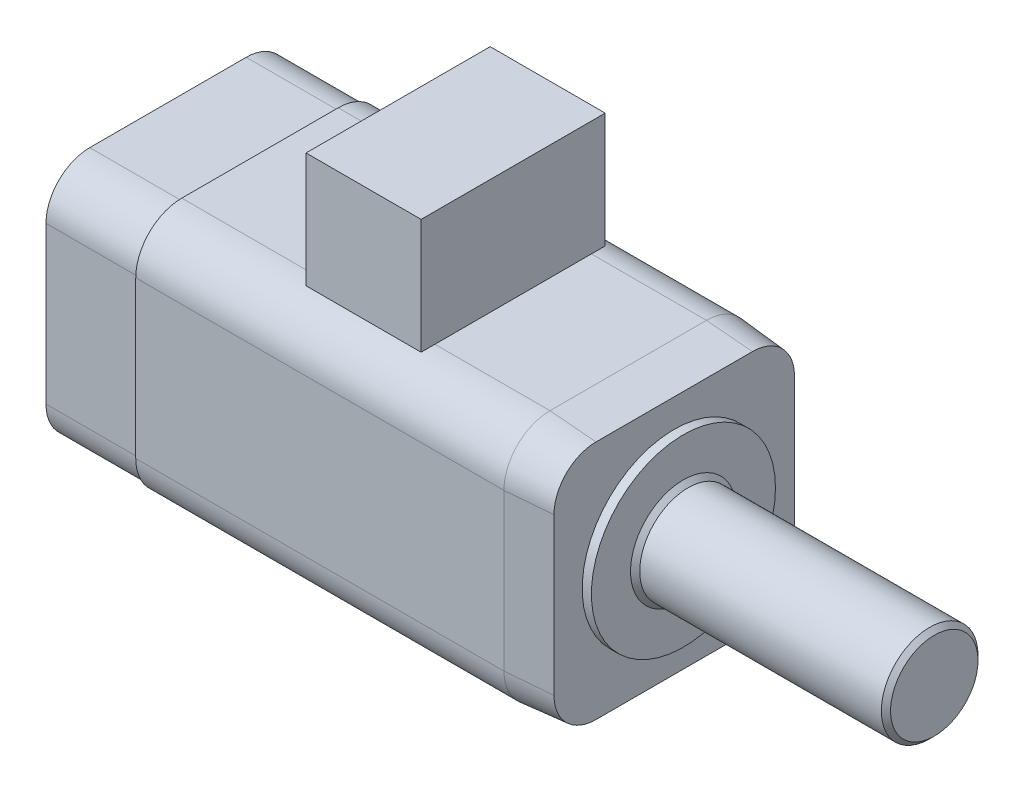
ISO-10303-21;
HEADER;
FILE_DESCRIPTION(('STEP AP214'),'2;1');
FILE_NAME('part.step','',(''),(''),'','','');
FILE_SCHEMA(('AUTOMOTIVE_DESIGN { 1 0 10303 214 1 1 1 1 }'));
ENDSEC;
DATA;
#1=APPLICATION_CONTEXT('core data for automotive mechanical design processes');
#2=APPLICATION_PROTOCOL_DEFINITION('international standard','automotive_design',2000,#1);
#3=PRODUCT_CONTEXT('',#1,'mechanical');
#4=PRODUCT('Part','Part','',(#3));
#5=PRODUCT_RELATED_PRODUCT_CATEGORY('part','',(#4));
#6=PRODUCT_DEFINITION_FORMATION('','',#4);
#7=PRODUCT_DEFINITION_CONTEXT('part definition',#1,'design');
#8=PRODUCT_DEFINITION('design','',#6,#7);
#9=PRODUCT_DEFINITION_SHAPE('','',#8);
#10=(LENGTH_UNIT() NAMED_UNIT(*) SI_UNIT(.MILLI.,.METRE.));
#11=(NAMED_UNIT(*) PLANE_ANGLE_UNIT() SI_UNIT($,.RADIAN.));
#12=(NAMED_UNIT(*) SI_UNIT($,.STERADIAN.) SOLID_ANGLE_UNIT());
#13=UNCERTAINTY_MEASURE_WITH_UNIT(LENGTH_MEASURE(1.E-05),#10,'distance_accuracy_value','');
#14=(GEOMETRIC_REPRESENTATION_CONTEXT(3) GLOBAL_UNCERTAINTY_ASSIGNED_CONTEXT((#13)) GLOBAL_UNIT_ASSIGNED_CONTEXT((#10,
#11,#12)) REPRESENTATION_CONTEXT('',''));
#15=CARTESIAN_POINT('',(0.,0.,0.));
#16=DIRECTION('',(0.,0.,1.));
#17=DIRECTION('',(1.,0.,0.));
#18=AXIS2_PLACEMENT_3D('',#15,#16,#17);
#19=CARTESIAN_POINT('',(-160.,34.0000000000001,-34.0000000000001));
#20=DIRECTION('',(-1.,0.,0.));
#21=DIRECTION('',(0.,0.,1.));
#22=AXIS2_PLACEMENT_3D('',#19,#20,#21);
#23=PLANE('',#22);
#24=CARTESIAN_POINT('',(-160.,34.0000000000001,-34.0000000000001));
#25=DIRECTION('',(-1.,0.,0.));
#26=DIRECTION('',(0.,0.,1.));
#27=AXIS2_PLACEMENT_3D('',#24,#25,#26);
#28=CIRCLE('',#27,20.);
#29=CARTESIAN_POINT('',(-160.,54.0000000000001,-34.0000000000001));
#30=VERTEX_POINT('',#29);
#31=CARTESIAN_POINT('',(-160.,34.0000000000001,-54.0000000000001));
#32=VERTEX_POINT('',#31);
#33=EDGE_CURVE('E269',#30,#32,#28,.T.);
#34=ORIENTED_EDGE('',*,*,#33,.T.);
#35=DIRECTION('',(0.,-1.,0.));
#36=VECTOR('',#35,1.);
#37=CARTESIAN_POINT('',(-160.,34.0000000000001,-54.0000000000001));
#38=LINE('',#37,#36);
#39=CARTESIAN_POINT('',(-160.,-34.0000000000001,-54.0000000000001));
#40=VERTEX_POINT('',#39);
#41=EDGE_CURVE('E272',#32,#40,#38,.T.);
#42=ORIENTED_EDGE('',*,*,#41,.T.);
#43=CARTESIAN_POINT('',(-160.,-34.0000000000001,-34.0000000000001));
#44=DIRECTION('',(-1.,0.,0.));
#45=DIRECTION('',(0.,0.,1.));
#46=AXIS2_PLACEMENT_3D('',#43,#44,#45);
#47=CIRCLE('',#46,19.9999999999999);
#48=CARTESIAN_POINT('',(-160.,-54.0000000000001,-34.0000000000002));
#49=VERTEX_POINT('',#48);
#50=EDGE_CURVE('E274',#40,#49,#47,.T.);
#51=ORIENTED_EDGE('',*,*,#50,.T.);
#52=DIRECTION('',(0.,0.,1.));
#53=VECTOR('',#52,1.);
#54=CARTESIAN_POINT('',(-160.,-54.0000000000001,-34.0000000000002));
#55=LINE('',#54,#53);
#56=CARTESIAN_POINT('',(-160.,-54.0000000000001,34.0000000000001));
#57=VERTEX_POINT('',#56);
#58=EDGE_CURVE('E276',#49,#57,#55,.T.);
#59=ORIENTED_EDGE('',*,*,#58,.T.);
#60=CARTESIAN_POINT('',(-160.,-34.0000000000001,34.0000000000001));
#61=DIRECTION('',(-1.,0.,0.));
#62=DIRECTION('',(0.,0.,1.));
#63=AXIS2_PLACEMENT_3D('',#60,#61,#62);
#64=CIRCLE('',#63,20.);
#65=CARTESIAN_POINT('',(-160.,-34.0000000000001,54.0000000000001));
#66=VERTEX_POINT('',#65);
#67=EDGE_CURVE('E278',#57,#66,#64,.T.);
#68=ORIENTED_EDGE('',*,*,#67,.T.);
#69=DIRECTION('',(0.,1.,0.));
#70=VECTOR('',#69,1.);
#71=CARTESIAN_POINT('',(-160.,-34.0000000000001,54.0000000000001));
#72=LINE('',#71,#70);
#73=CARTESIAN_POINT('',(-160.,34.0000000000001,54.));
#74=VERTEX_POINT('',#73);
#75=EDGE_CURVE('E280',#66,#74,#72,.T.);
#76=ORIENTED_EDGE('',*,*,#75,.T.);
#77=CARTESIAN_POINT('',(-160.,34.0000000000001,34.0000000000001));
#78=DIRECTION('',(-1.,0.,0.));
#79=DIRECTION('',(0.,0.,1.));
#80=AXIS2_PLACEMENT_3D('',#77,#78,#79);
#81=CIRCLE('',#80,20.);
#82=CARTESIAN_POINT('',(-160.,54.0000000000001,34.0000000000001));
#83=VERTEX_POINT('',#82);
#84=EDGE_CURVE('E282',#74,#83,#81,.T.);
#85=ORIENTED_EDGE('',*,*,#84,.T.);
#86=DIRECTION('',(0.,0.,-1.));
#87=VECTOR('',#86,1.);
#88=CARTESIAN_POINT('',(-160.,54.0000000000001,34.0000000000001));
#89=LINE('',#88,#87);
#90=EDGE_CURVE('E284',#83,#30,#89,.T.);
#91=ORIENTED_EDGE('',*,*,#90,.T.);
#92=EDGE_LOOP('',(#34,#42,#51,#59,#68,#76,#85,#91));
#93=FACE_BOUND('',#92,.T.);
#94=DIRECTION('',(0.,-1.,0.));
#95=VECTOR('',#94,1.);
#96=CARTESIAN_POINT('',(-160.,34.0000000000001,-53.0000000000001));
#97=LINE('',#96,#95);
#98=CARTESIAN_POINT('',(-160.,34.0000000000001,-53.0000000000001));
#99=VERTEX_POINT('',#98);
#100=CARTESIAN_POINT('',(-160.,-34.0000000000001,-53.0000000000001));
#101=VERTEX_POINT('',#100);
#102=EDGE_CURVE('E751',#99,#101,#97,.T.);
#103=ORIENTED_EDGE('',*,*,#102,.F.);
#104=CARTESIAN_POINT('',(-160.,34.0000000000001,-34.0000000000001));
#105=DIRECTION('',(-1.,0.,0.));
#106=DIRECTION('',(0.,0.,1.));
#107=AXIS2_PLACEMENT_3D('',#104,#105,#106);
#108=CIRCLE('',#107,19.);
#109=CARTESIAN_POINT('',(-160.,53.0000000000001,-34.0000000000001));
#110=VERTEX_POINT('',#109);
#111=EDGE_CURVE('E229',#110,#99,#108,.T.);
#112=ORIENTED_EDGE('',*,*,#111,.F.);
#113=DIRECTION('',(0.,0.,-1.));
#114=VECTOR('',#113,1.);
#115=CARTESIAN_POINT('',(-160.,53.0000000000001,34.0000000000001));
#116=LINE('',#115,#114);
#117=CARTESIAN_POINT('',(-160.,53.0000000000001,34.0000000000001));
#118=VERTEX_POINT('',#117);
#119=EDGE_CURVE('E225',#118,#110,#116,.T.);
#120=ORIENTED_EDGE('',*,*,#119,.F.);
#121=CARTESIAN_POINT('',(-160.,34.0000000000001,34.0000000000001));
#122=DIRECTION('',(-1.,0.,0.));
#123=DIRECTION('',(0.,0.,1.));
#124=AXIS2_PLACEMENT_3D('',#121,#122,#123);
#125=CIRCLE('',#124,19.);
#126=CARTESIAN_POINT('',(-160.,34.0000000000001,53.));
#127=VERTEX_POINT('',#126);
#128=EDGE_CURVE('E747',#127,#118,#125,.T.);
#129=ORIENTED_EDGE('',*,*,#128,.F.);
#130=DIRECTION('',(0.,1.,0.));
#131=VECTOR('',#130,1.);
#132=CARTESIAN_POINT('',(-160.,-34.0000000000001,53.0000000000001));
#133=LINE('',#132,#131);
#134=CARTESIAN_POINT('',(-160.,-34.0000000000001,53.0000000000001));
#135=VERTEX_POINT('',#134);
#136=EDGE_CURVE('E763',#135,#127,#133,.T.);
#137=ORIENTED_EDGE('',*,*,#136,.F.);
#138=CARTESIAN_POINT('',(-160.,-34.0000000000001,34.0000000000001));
#139=DIRECTION('',(-1.,0.,0.));
#140=DIRECTION('',(0.,0.,1.));
#141=AXIS2_PLACEMENT_3D('',#138,#139,#140);
#142=CIRCLE('',#141,19.);
#143=CARTESIAN_POINT('',(-160.,-53.0000000000001,34.0000000000001));
#144=VERTEX_POINT('',#143);
#145=EDGE_CURVE('E761',#144,#135,#142,.T.);
#146=ORIENTED_EDGE('',*,*,#145,.F.);
#147=DIRECTION('',(0.,0.,1.));
#148=VECTOR('',#147,1.);
#149=CARTESIAN_POINT('',(-160.,-53.0000000000001,-34.0000000000001));
#150=LINE('',#149,#148);
#151=CARTESIAN_POINT('',(-160.,-53.0000000000001,-34.0000000000001));
#152=VERTEX_POINT('',#151);
#153=EDGE_CURVE('E759',#152,#144,#150,.T.);
#154=ORIENTED_EDGE('',*,*,#153,.F.);
#155=CARTESIAN_POINT('',(-160.,-34.0000000000001,-34.0000000000001));
#156=DIRECTION('',(-1.,0.,0.));
#157=DIRECTION('',(0.,0.,1.));
#158=AXIS2_PLACEMENT_3D('',#155,#156,#157);
#159=CIRCLE('',#158,18.9999999999999);
#160=EDGE_CURVE('E753',#101,#152,#159,.T.);
#161=ORIENTED_EDGE('',*,*,#160,.F.);
#162=EDGE_LOOP('',(#103,#112,#120,#129,#137,#146,#154,#161));
#163=FACE_BOUND('',#162,.T.);
#164=ADVANCED_FACE('F33',(#93,#163),#23,.T.);
#165=CARTESIAN_POINT('',(-160.,54.0000000000001,34.0000000000001));
#166=DIRECTION('',(0.,-1.,0.));
#167=DIRECTION('',(0.,0.,-1.));
#168=AXIS2_PLACEMENT_3D('',#165,#166,#167);
#169=PLANE('',#168);
#170=DIRECTION('',(0.,0.,1.));
#171=VECTOR('',#170,1.);
#172=CARTESIAN_POINT('',(-100.,54.0000000000001,34.0000000000001));
#173=LINE('',#172,#171);
#174=CARTESIAN_POINT('',(-100.,54.0000000000001,-34.0000000000001));
#175=VERTEX_POINT('',#174);
#176=CARTESIAN_POINT('',(-100.,54.0000000000001,34.0000000000001));
#177=VERTEX_POINT('',#176);
#178=EDGE_CURVE('E11',#175,#177,#173,.T.);
#179=ORIENTED_EDGE('',*,*,#178,.F.);
#180=DIRECTION('',(1.,0.,0.));
#181=VECTOR('',#180,1.);
#182=CARTESIAN_POINT('',(-160.,54.0000000000001,-34.0000000000001));
#183=LINE('',#182,#181);
#184=EDGE_CURVE('E287',#30,#175,#183,.T.);
#185=ORIENTED_EDGE('',*,*,#184,.F.);
#186=ORIENTED_EDGE('',*,*,#90,.F.);
#187=DIRECTION('',(1.,0.,0.));
#188=VECTOR('',#187,1.);
#189=CARTESIAN_POINT('',(-160.,54.0000000000001,34.0000000000001));
#190=LINE('',#189,#188);
#191=EDGE_CURVE('E292',#83,#177,#190,.T.);
#192=ORIENTED_EDGE('',*,*,#191,.T.);
#193=EDGE_LOOP('',(#179,#185,#186,#192));
#194=FACE_BOUND('',#193,.T.);
#195=ADVANCED_FACE('F503',(#194),#169,.F.);
#196=DIRECTION('',(0.,0.,-1.));
#197=VECTOR('',#196,1.);
#198=CARTESIAN_POINT('',(-50.,54.0000000000001,34.0000000000001));
#199=LINE('',#198,#197);
#200=CARTESIAN_POINT('',(-50.,54.0000000000001,34.0000000000001));
#201=VERTEX_POINT('',#200);
#202=CARTESIAN_POINT('',(-50.,54.0000000000001,-34.0000000000001));
#203=VERTEX_POINT('',#202);
#204=EDGE_CURVE('E41',#201,#203,#199,.T.);
#205=ORIENTED_EDGE('',*,*,#204,.F.);
#206=CARTESIAN_POINT('',(0.,54.0000000000001,34.0000000000001));
#207=VERTEX_POINT('',#206);
#208=EDGE_CURVE('E290',#201,#207,#190,.T.);
#209=ORIENTED_EDGE('',*,*,#208,.T.);
#210=DIRECTION('',(0.,0.,1.));
#211=VECTOR('',#210,1.);
#212=CARTESIAN_POINT('',(0.,54.0000000000001,34.0000000000001));
#213=LINE('',#212,#211);
#214=CARTESIAN_POINT('',(0.,54.0000000000001,-34.0000000000001));
#215=VERTEX_POINT('',#214);
#216=EDGE_CURVE('E322',#215,#207,#213,.T.);
#217=ORIENTED_EDGE('',*,*,#216,.F.);
#218=EDGE_CURVE('E286',#203,#215,#183,.T.);
#219=ORIENTED_EDGE('',*,*,#218,.F.);
#220=EDGE_LOOP('',(#205,#209,#217,#219));
#221=FACE_BOUND('',#220,.T.);
#222=ADVANCED_FACE('F411',(#221),#169,.F.);
#223=CARTESIAN_POINT('',(24.,0.,0.));
#224=DIRECTION('',(1.,0.,0.));
#225=DIRECTION('',(0.,0.,-1.));
#226=AXIS2_PLACEMENT_3D('',#223,#224,#225);
#227=PLANE('',#226);
#228=CARTESIAN_POINT('',(24.,0.,0.));
#229=DIRECTION('',(1.,0.,0.));
#230=DIRECTION('',(0.,0.,-1.));
#231=AXIS2_PLACEMENT_3D('',#228,#229,#230);
#232=CIRCLE('',#231,23.);
#233=CARTESIAN_POINT('',(24.,0.,-23.));
#234=VERTEX_POINT('',#233);
#235=EDGE_CURVE('E387',#234,#234,#232,.F.);
#236=ORIENTED_EDGE('',*,*,#235,.T.);
#237=EDGE_LOOP('',(#236));
#238=FACE_BOUND('',#237,.T.);
#239=CARTESIAN_POINT('',(24.,0.,0.));
#240=DIRECTION('',(1.,0.,0.));
#241=DIRECTION('',(0.,0.,-1.));
#242=AXIS2_PLACEMENT_3D('',#239,#240,#241);
#243=CIRCLE('',#242,40.);
#244=CARTESIAN_POINT('',(24.,0.,-40.));
#245=VERTEX_POINT('',#244);
#246=EDGE_CURVE('E314',#245,#245,#243,.T.);
#247=ORIENTED_EDGE('',*,*,#246,.T.);
#248=EDGE_LOOP('',(#247));
#249=FACE_BOUND('',#248,.T.);
#250=ADVANCED_FACE('F534',(#238,#249),#227,.T.);
#251=CARTESIAN_POINT('',(20.,34.0000000000001,-34.0000000000001));
#252=DIRECTION('',(1.,0.,0.));
#253=DIRECTION('',(0.,0.,-1.));
#254=AXIS2_PLACEMENT_3D('',#251,#252,#253);
#255=PLANE('',#254);
#256=CARTESIAN_POINT('',(20.,34.0000000000001,-34.0000000000001));
#257=DIRECTION('',(1.,0.,0.));
#258=DIRECTION('',(0.,0.,-1.));
#259=AXIS2_PLACEMENT_3D('',#256,#257,#258);
#260=CIRCLE('',#259,18.2502267294815);
#261=CARTESIAN_POINT('',(20.,34.0000000000001,-52.2502267294816));
#262=VERTEX_POINT('',#261);
#263=CARTESIAN_POINT('',(20.,52.2502267294817,-34.0000000000001));
#264=VERTEX_POINT('',#263);
#265=EDGE_CURVE('E343',#262,#264,#260,.T.);
#266=ORIENTED_EDGE('',*,*,#265,.T.);
#267=DIRECTION('',(0.,0.,-1.));
#268=VECTOR('',#267,1.);
#269=CARTESIAN_POINT('',(20.,52.2502267294816,34.0000000000001));
#270=LINE('',#269,#268);
#271=CARTESIAN_POINT('',(20.,52.2502267294816,34.0000000000001));
#272=VERTEX_POINT('',#271);
#273=EDGE_CURVE('E372',#264,#272,#270,.F.);
#274=ORIENTED_EDGE('',*,*,#273,.T.);
#275=CARTESIAN_POINT('',(20.,34.0000000000001,34.0000000000001));
#276=DIRECTION('',(1.,0.,0.));
#277=DIRECTION('',(0.,0.,-1.));
#278=AXIS2_PLACEMENT_3D('',#275,#276,#277);
#279=CIRCLE('',#278,18.2502267294815);
#280=CARTESIAN_POINT('',(20.,34.0000000000001,52.2502267294816));
#281=VERTEX_POINT('',#280);
#282=EDGE_CURVE('E374',#272,#281,#279,.T.);
#283=ORIENTED_EDGE('',*,*,#282,.T.);
#284=DIRECTION('',(0.,1.,0.));
#285=VECTOR('',#284,1.);
#286=CARTESIAN_POINT('',(20.,34.0000000000001,52.2502267294816));
#287=LINE('',#286,#285);
#288=CARTESIAN_POINT('',(20.,-34.0000000000001,52.2502267294816));
#289=VERTEX_POINT('',#288);
#290=EDGE_CURVE('E376',#281,#289,#287,.F.);
#291=ORIENTED_EDGE('',*,*,#290,.T.);
#292=CARTESIAN_POINT('',(20.,-34.0000000000001,34.0000000000001));
#293=DIRECTION('',(1.,0.,0.));
#294=DIRECTION('',(0.,0.,-1.));
#295=AXIS2_PLACEMENT_3D('',#292,#293,#294);
#296=CIRCLE('',#295,18.2502267294815);
#297=CARTESIAN_POINT('',(20.,-52.2502267294816,34.0000000000001));
#298=VERTEX_POINT('',#297);
#299=EDGE_CURVE('E378',#289,#298,#296,.T.);
#300=ORIENTED_EDGE('',*,*,#299,.T.);
#301=DIRECTION('',(0.,0.,1.));
#302=VECTOR('',#301,1.);
#303=CARTESIAN_POINT('',(20.,-52.2502267294816,34.0000000000001));
#304=LINE('',#303,#302);
#305=CARTESIAN_POINT('',(20.,-52.2502267294816,-34.0000000000002));
#306=VERTEX_POINT('',#305);
#307=EDGE_CURVE('E380',#298,#306,#304,.F.);
#308=ORIENTED_EDGE('',*,*,#307,.T.);
#309=CARTESIAN_POINT('',(20.,-34.0000000000001,-34.0000000000001));
#310=DIRECTION('',(1.,0.,0.));
#311=DIRECTION('',(0.,0.,-1.));
#312=AXIS2_PLACEMENT_3D('',#309,#310,#311);
#313=CIRCLE('',#312,18.2502267294815);
#314=CARTESIAN_POINT('',(20.,-34.0000000000001,-52.2502267294816));
#315=VERTEX_POINT('',#314);
#316=EDGE_CURVE('E382',#306,#315,#313,.T.);
#317=ORIENTED_EDGE('',*,*,#316,.T.);
#318=DIRECTION('',(0.,-1.,0.));
#319=VECTOR('',#318,1.);
#320=CARTESIAN_POINT('',(20.,34.0000000000001,-52.2502267294816));
#321=LINE('',#320,#319);
#322=EDGE_CURVE('E353',#315,#262,#321,.F.);
#323=ORIENTED_EDGE('',*,*,#322,.T.);
#324=EDGE_LOOP('',(#266,#274,#283,#291,#300,#308,#317,#323));
#325=FACE_BOUND('',#324,.T.);
#326=CARTESIAN_POINT('',(20.,0.,0.));
#327=DIRECTION('',(1.,0.,0.));
#328=DIRECTION('',(0.,0.,-1.));
#329=AXIS2_PLACEMENT_3D('',#326,#327,#328);
#330=CIRCLE('',#329,40.);
#331=CARTESIAN_POINT('',(20.,0.,-40.));
#332=VERTEX_POINT('',#331);
#333=EDGE_CURVE('E313',#332,#332,#330,.T.);
#334=ORIENTED_EDGE('',*,*,#333,.F.);
#335=EDGE_LOOP('',(#334));
#336=FACE_BOUND('',#335,.T.);
#337=ADVANCED_FACE('F425',(#325,#336),#255,.T.);
#338=CARTESIAN_POINT('',(0.,34.0000000000001,-34.0000000000001));
#339=DIRECTION('',(-1.,0.,0.));
#340=DIRECTION('',(0.,0.,-1.));
#341=AXIS2_PLACEMENT_3D('',#338,#339,#340);
#342=CONICAL_SURFACE('',#341,20.,0.0872664625997167);
#343=CARTESIAN_POINT('',(0.,34.0000000000001,-34.0000000000001));
#344=DIRECTION('',(1.,0.,0.));
#345=DIRECTION('',(0.,0.,-1.));
#346=AXIS2_PLACEMENT_3D('',#343,#344,#345);
#347=CIRCLE('',#346,20.);
#348=CARTESIAN_POINT('',(0.,34.0000000000001,-54.0000000000001));
#349=VERTEX_POINT('',#348);
#350=EDGE_CURVE('E317',#349,#215,#347,.T.);
#351=ORIENTED_EDGE('',*,*,#350,.T.);
#352=DIRECTION('',(-0.996194698091745,0.0871557427476584,0.));
#353=VECTOR('',#352,1.);
#354=CARTESIAN_POINT('',(0.,54.0000000000001,-34.0000000000001));
#355=LINE('',#354,#353);
#356=EDGE_CURVE('E344',#264,#215,#355,.T.);
#357=ORIENTED_EDGE('',*,*,#356,.F.);
#358=ORIENTED_EDGE('',*,*,#265,.F.);
#359=DIRECTION('',(-0.996194698091745,0.,-0.0871557427476584));
#360=VECTOR('',#359,1.);
#361=CARTESIAN_POINT('',(0.,34.0000000000001,-54.0000000000001));
#362=LINE('',#361,#360);
#363=EDGE_CURVE('E349',#262,#349,#362,.T.);
#364=ORIENTED_EDGE('',*,*,#363,.T.);
#365=EDGE_LOOP('',(#351,#357,#358,#364));
#366=FACE_BOUND('',#365,.T.);
#367=ADVANCED_FACE('F432',(#366),#342,.T.);
#368=CARTESIAN_POINT('',(0.,54.0000000000001,34.0000000000001));
#369=DIRECTION('',(0.0871557427476584,0.996194698091746,0.));
#370=DIRECTION('',(-0.996194698091746,0.0871557427476584,0.));
#371=AXIS2_PLACEMENT_3D('',#368,#369,#370);
#372=PLANE('',#371);
#373=ORIENTED_EDGE('',*,*,#216,.T.);
#374=DIRECTION('',(-0.996194698091745,0.0871557427476584,0.));
#375=VECTOR('',#374,1.);
#376=CARTESIAN_POINT('',(0.,54.0000000000001,34.0000000000001));
#377=LINE('',#376,#375);
#378=EDGE_CURVE('E348',#272,#207,#377,.T.);
#379=ORIENTED_EDGE('',*,*,#378,.F.);
#380=ORIENTED_EDGE('',*,*,#273,.F.);
#381=ORIENTED_EDGE('',*,*,#356,.T.);
#382=EDGE_LOOP('',(#373,#379,#380,#381));
#383=FACE_BOUND('',#382,.T.);
#384=ADVANCED_FACE('F419',(#383),#372,.T.);
#385=CARTESIAN_POINT('',(0.,34.0000000000001,34.0000000000001));
#386=DIRECTION('',(-1.,0.,0.));
#387=DIRECTION('',(0.,0.,1.));
#388=AXIS2_PLACEMENT_3D('',#385,#386,#387);
#389=CONICAL_SURFACE('',#388,20.,0.0872664625997167);
#390=CARTESIAN_POINT('',(0.,34.0000000000001,34.0000000000001));
#391=DIRECTION('',(1.,0.,0.));
#392=DIRECTION('',(0.,0.,1.));
#393=AXIS2_PLACEMENT_3D('',#390,#391,#392);
#394=CIRCLE('',#393,20.);
#395=CARTESIAN_POINT('',(0.,34.0000000000001,54.));
#396=VERTEX_POINT('',#395);
#397=EDGE_CURVE('E325',#207,#396,#394,.T.);
#398=ORIENTED_EDGE('',*,*,#397,.T.);
#399=DIRECTION('',(-0.996194698091745,0.,0.0871557427476584));
#400=VECTOR('',#399,1.);
#401=CARTESIAN_POINT('',(0.,34.0000000000001,54.));
#402=LINE('',#401,#400);
#403=EDGE_CURVE('E365',#281,#396,#402,.T.);
#404=ORIENTED_EDGE('',*,*,#403,.F.);
#405=ORIENTED_EDGE('',*,*,#282,.F.);
#406=ORIENTED_EDGE('',*,*,#378,.T.);
#407=EDGE_LOOP('',(#398,#404,#405,#406));
#408=FACE_BOUND('',#407,.T.);
#409=ADVANCED_FACE('F422',(#408),#389,.T.);
#410=CARTESIAN_POINT('',(0.,34.0000000000001,54.));
#411=DIRECTION('',(0.0871557427476584,0.,0.996194698091746));
#412=DIRECTION('',(0.996194698091746,0.,-0.0871557427476584));
#413=AXIS2_PLACEMENT_3D('',#410,#411,#412);
#414=PLANE('',#413);
#415=DIRECTION('',(0.,-1.,0.));
#416=VECTOR('',#415,1.);
#417=CARTESIAN_POINT('',(0.,34.0000000000001,54.));
#418=LINE('',#417,#416);
#419=CARTESIAN_POINT('',(0.,-34.0000000000001,54.0000000000001));
#420=VERTEX_POINT('',#419);
#421=EDGE_CURVE('E328',#396,#420,#418,.T.);
#422=ORIENTED_EDGE('',*,*,#421,.T.);
#423=DIRECTION('',(-0.996194698091745,0.,0.0871557427476584));
#424=VECTOR('',#423,1.);
#425=CARTESIAN_POINT('',(0.,-34.0000000000001,54.0000000000001));
#426=LINE('',#425,#424);
#427=EDGE_CURVE('E362',#289,#420,#426,.T.);
#428=ORIENTED_EDGE('',*,*,#427,.F.);
#429=ORIENTED_EDGE('',*,*,#290,.F.);
#430=ORIENTED_EDGE('',*,*,#403,.T.);
#431=EDGE_LOOP('',(#422,#428,#429,#430));
#432=FACE_BOUND('',#431,.T.);
#433=ADVANCED_FACE('F468',(#432),#414,.T.);
#434=CARTESIAN_POINT('',(0.,-34.0000000000001,34.0000000000001));
#435=DIRECTION('',(-1.,0.,0.));
#436=DIRECTION('',(0.,0.,1.));
#437=AXIS2_PLACEMENT_3D('',#434,#435,#436);
#438=CONICAL_SURFACE('',#437,20.,0.0872664625997167);
#439=CARTESIAN_POINT('',(0.,-34.0000000000001,34.0000000000001));
#440=DIRECTION('',(1.,0.,0.));
#441=DIRECTION('',(0.,0.,1.));
#442=AXIS2_PLACEMENT_3D('',#439,#440,#441);
#443=CIRCLE('',#442,20.);
#444=CARTESIAN_POINT('',(0.,-54.0000000000001,34.0000000000001));
#445=VERTEX_POINT('',#444);
#446=EDGE_CURVE('E331',#420,#445,#443,.T.);
#447=ORIENTED_EDGE('',*,*,#446,.T.);
#448=DIRECTION('',(-0.996194698091745,-0.0871557427476584,0.));
#449=VECTOR('',#448,1.);
#450=CARTESIAN_POINT('',(0.,-54.0000000000001,34.0000000000001));
#451=LINE('',#450,#449);
#452=EDGE_CURVE('E359',#298,#445,#451,.T.);
#453=ORIENTED_EDGE('',*,*,#452,.F.);
#454=ORIENTED_EDGE('',*,*,#299,.F.);
#455=ORIENTED_EDGE('',*,*,#427,.T.);
#456=EDGE_LOOP('',(#447,#453,#454,#455));
#457=FACE_BOUND('',#456,.T.);
#458=ADVANCED_FACE('F465',(#457),#438,.T.);
#459=CARTESIAN_POINT('',(0.,-54.0000000000001,34.0000000000001));
#460=DIRECTION('',(0.0871557427476584,-0.996194698091746,0.));
#461=DIRECTION('',(0.996194698091746,0.0871557427476584,0.));
#462=AXIS2_PLACEMENT_3D('',#459,#460,#461);
#463=PLANE('',#462);
#464=DIRECTION('',(0.,0.,-1.));
#465=VECTOR('',#464,1.);
#466=CARTESIAN_POINT('',(0.,-54.0000000000001,34.0000000000001));
#467=LINE('',#466,#465);
#468=CARTESIAN_POINT('',(0.,-54.0000000000001,-34.0000000000002));
#469=VERTEX_POINT('',#468);
#470=EDGE_CURVE('E334',#445,#469,#467,.T.);
#471=ORIENTED_EDGE('',*,*,#470,.T.);
#472=DIRECTION('',(-0.996194698091745,-0.0871557427476584,0.));
#473=VECTOR('',#472,1.);
#474=CARTESIAN_POINT('',(0.,-54.0000000000001,-34.0000000000002));
#475=LINE('',#474,#473);
#476=EDGE_CURVE('E356',#306,#469,#475,.T.);
#477=ORIENTED_EDGE('',*,*,#476,.F.);
#478=ORIENTED_EDGE('',*,*,#307,.F.);
#479=ORIENTED_EDGE('',*,*,#452,.T.);
#480=EDGE_LOOP('',(#471,#477,#478,#479));
#481=FACE_BOUND('',#480,.T.);
#482=ADVANCED_FACE('F454',(#481),#463,.T.);
#483=CARTESIAN_POINT('',(0.,-34.0000000000001,-34.0000000000001));
#484=DIRECTION('',(-1.,0.,0.));
#485=DIRECTION('',(0.,0.,1.));
#486=AXIS2_PLACEMENT_3D('',#483,#484,#485);
#487=CONICAL_SURFACE('',#486,20.,0.0872664625997167);
#488=CARTESIAN_POINT('',(0.,-34.0000000000001,-34.0000000000001));
#489=DIRECTION('',(1.,0.,0.));
#490=DIRECTION('',(0.,0.,1.));
#491=AXIS2_PLACEMENT_3D('',#488,#489,#490);
#492=CIRCLE('',#491,20.);
#493=CARTESIAN_POINT('',(0.,-34.0000000000001,-54.0000000000001));
#494=VERTEX_POINT('',#493);
#495=EDGE_CURVE('E337',#469,#494,#492,.T.);
#496=ORIENTED_EDGE('',*,*,#495,.T.);
#497=DIRECTION('',(-0.996194698091745,0.,-0.0871557427476584));
#498=VECTOR('',#497,1.);
#499=CARTESIAN_POINT('',(0.,-34.0000000000001,-54.));
#500=LINE('',#499,#498);
#501=EDGE_CURVE('E352',#315,#494,#500,.T.);
#502=ORIENTED_EDGE('',*,*,#501,.F.);
#503=ORIENTED_EDGE('',*,*,#316,.F.);
#504=ORIENTED_EDGE('',*,*,#476,.T.);
#505=EDGE_LOOP('',(#496,#502,#503,#504));
#506=FACE_BOUND('',#505,.T.);
#507=ADVANCED_FACE('F449',(#506),#487,.T.);
#508=CARTESIAN_POINT('',(0.,34.0000000000001,-54.));
#509=DIRECTION('',(0.0871557427476584,0.,-0.996194698091746));
#510=DIRECTION('',(-0.996194698091746,0.,-0.0871557427476584));
#511=AXIS2_PLACEMENT_3D('',#508,#509,#510);
#512=PLANE('',#511);
#513=DIRECTION('',(0.,1.,0.));
#514=VECTOR('',#513,1.);
#515=CARTESIAN_POINT('',(0.,34.0000000000001,-54.));
#516=LINE('',#515,#514);
#517=EDGE_CURVE('E340',#494,#349,#516,.T.);
#518=ORIENTED_EDGE('',*,*,#517,.T.);
#519=ORIENTED_EDGE('',*,*,#363,.F.);
#520=ORIENTED_EDGE('',*,*,#322,.F.);
#521=ORIENTED_EDGE('',*,*,#501,.T.);
#522=EDGE_LOOP('',(#518,#519,#520,#521));
#523=FACE_BOUND('',#522,.T.);
#524=ADVANCED_FACE('F439',(#523),#512,.T.);
#525=CARTESIAN_POINT('',(24.,0.,0.));
#526=DIRECTION('',(-1.,0.,0.));
#527=DIRECTION('',(0.,0.,1.));
#528=AXIS2_PLACEMENT_3D('',#525,#526,#527);
#529=CYLINDRICAL_SURFACE('',#528,40.);
#530=ORIENTED_EDGE('',*,*,#246,.F.);
#531=EDGE_LOOP('',(#530));
#532=FACE_BOUND('',#531,.T.);
#533=ORIENTED_EDGE('',*,*,#333,.T.);
#534=EDGE_LOOP('',(#533));
#535=FACE_BOUND('',#534,.T.);
#536=ADVANCED_FACE('F532',(#532,#535),#529,.T.);
#537=CARTESIAN_POINT('',(133.,0.,0.));
#538=DIRECTION('',(-1.,0.,0.));
#539=DIRECTION('',(0.,0.,1.));
#540=AXIS2_PLACEMENT_3D('',#537,#538,#539);
#541=CYLINDRICAL_SURFACE('',#540,21.);
#542=CARTESIAN_POINT('',(131.,0.,0.));
#543=DIRECTION('',(1.,0.,0.));
#544=DIRECTION('',(0.,0.,-1.));
#545=AXIS2_PLACEMENT_3D('',#542,#543,#544);
#546=CIRCLE('',#545,21.);
#547=CARTESIAN_POINT('',(131.,0.,-21.));
#548=VERTEX_POINT('',#547);
#549=EDGE_CURVE('E393',#548,#548,#546,.F.);
#550=ORIENTED_EDGE('',*,*,#549,.T.);
#551=EDGE_LOOP('',(#550));
#552=FACE_BOUND('',#551,.T.);
#553=CARTESIAN_POINT('',(26.,0.,0.));
#554=DIRECTION('',(1.,0.,0.));
#555=DIRECTION('',(0.,0.,-1.));
#556=AXIS2_PLACEMENT_3D('',#553,#554,#555);
#557=CIRCLE('',#556,21.);
#558=CARTESIAN_POINT('',(26.,0.,-21.));
#559=VERTEX_POINT('',#558);
#560=EDGE_CURVE('E347',#559,#559,#557,.T.);
#561=ORIENTED_EDGE('',*,*,#560,.T.);
#562=EDGE_LOOP('',(#561));
#563=FACE_BOUND('',#562,.T.);
#564=ADVANCED_FACE('F528',(#552,#563),#541,.T.);
#565=CARTESIAN_POINT('',(133.,0.,0.));
#566=DIRECTION('',(1.,0.,0.));
#567=DIRECTION('',(0.,0.,-1.));
#568=AXIS2_PLACEMENT_3D('',#565,#566,#567);
#569=PLANE('',#568);
#570=CARTESIAN_POINT('',(133.,0.,0.));
#571=DIRECTION('',(1.,0.,0.));
#572=DIRECTION('',(0.,0.,-1.));
#573=AXIS2_PLACEMENT_3D('',#570,#571,#572);
#574=CIRCLE('',#573,19.);
#575=CARTESIAN_POINT('',(133.,0.,-19.));
#576=VERTEX_POINT('',#575);
#577=EDGE_CURVE('E390',#576,#576,#574,.T.);
#578=ORIENTED_EDGE('',*,*,#577,.T.);
#579=EDGE_LOOP('',(#578));
#580=FACE_BOUND('',#579,.T.);
#581=ADVANCED_FACE('F524',(#580),#569,.T.);
#582=CARTESIAN_POINT('',(26.,0.,0.));
#583=DIRECTION('',(-1.,0.,0.));
#584=DIRECTION('',(0.,0.,1.));
#585=AXIS2_PLACEMENT_3D('',#582,#583,#584);
#586=CONICAL_SURFACE('',#585,21.,0.785398163397439);
#587=ORIENTED_EDGE('',*,*,#235,.F.);
#588=EDGE_LOOP('',(#587));
#589=FACE_BOUND('',#588,.T.);
#590=ORIENTED_EDGE('',*,*,#560,.F.);
#591=EDGE_LOOP('',(#590));
#592=FACE_BOUND('',#591,.T.);
#593=ADVANCED_FACE('F527',(#589,#592),#586,.T.);
#594=CARTESIAN_POINT('',(133.,0.,0.));
#595=DIRECTION('',(-1.,0.,0.));
#596=DIRECTION('',(0.,0.,1.));
#597=AXIS2_PLACEMENT_3D('',#594,#595,#596);
#598=CONICAL_SURFACE('',#597,19.,0.785398163397451);
#599=ORIENTED_EDGE('',*,*,#549,.F.);
#600=EDGE_LOOP('',(#599));
#601=FACE_BOUND('',#600,.T.);
#602=ORIENTED_EDGE('',*,*,#577,.F.);
#603=EDGE_LOOP('',(#602));
#604=FACE_BOUND('',#603,.T.);
#605=ADVANCED_FACE('F35',(#601,#604),#598,.T.);
#606=CARTESIAN_POINT('',(-160.,34.0000000000001,-34.0000000000001));
#607=DIRECTION('',(1.,0.,0.));
#608=DIRECTION('',(0.,0.,-1.));
#609=AXIS2_PLACEMENT_3D('',#606,#607,#608);
#610=CYLINDRICAL_SURFACE('',#609,20.);
#611=ORIENTED_EDGE('',*,*,#350,.F.);
#612=DIRECTION('',(1.,0.,0.));
#613=VECTOR('',#612,1.);
#614=CARTESIAN_POINT('',(-160.,34.0000000000001,-54.0000000000001));
#615=LINE('',#614,#613);
#616=EDGE_CURVE('E311',#32,#349,#615,.T.);
#617=ORIENTED_EDGE('',*,*,#616,.F.);
#618=ORIENTED_EDGE('',*,*,#33,.F.);
#619=ORIENTED_EDGE('',*,*,#184,.T.);
#620=EDGE_CURVE('E291',#175,#203,#183,.T.);
#621=ORIENTED_EDGE('',*,*,#620,.T.);
#622=ORIENTED_EDGE('',*,*,#218,.T.);
#623=EDGE_LOOP('',(#611,#617,#618,#619,#621,#622));
#624=FACE_BOUND('',#623,.T.);
#625=ADVANCED_FACE('F436',(#624),#610,.T.);
#626=CARTESIAN_POINT('',(-160.,34.0000000000001,-54.0000000000001));
#627=DIRECTION('',(0.,0.,1.));
#628=DIRECTION('',(0.,-1.,0.));
#629=AXIS2_PLACEMENT_3D('',#626,#627,#628);
#630=PLANE('',#629);
#631=ORIENTED_EDGE('',*,*,#517,.F.);
#632=DIRECTION('',(1.,0.,0.));
#633=VECTOR('',#632,1.);
#634=CARTESIAN_POINT('',(-160.,-34.0000000000001,-54.0000000000001));
#635=LINE('',#634,#633);
#636=EDGE_CURVE('E308',#40,#494,#635,.T.);
#637=ORIENTED_EDGE('',*,*,#636,.F.);
#638=ORIENTED_EDGE('',*,*,#41,.F.);
#639=ORIENTED_EDGE('',*,*,#616,.T.);
#640=EDGE_LOOP('',(#631,#637,#638,#639));
#641=FACE_BOUND('',#640,.T.);
#642=ADVANCED_FACE('F443',(#641),#630,.F.);
#643=CARTESIAN_POINT('',(-160.,-34.0000000000001,-34.0000000000001));
#644=DIRECTION('',(1.,0.,0.));
#645=DIRECTION('',(0.,0.,-1.));
#646=AXIS2_PLACEMENT_3D('',#643,#644,#645);
#647=CYLINDRICAL_SURFACE('',#646,19.9999999999999);
#648=ORIENTED_EDGE('',*,*,#495,.F.);
#649=DIRECTION('',(1.,0.,0.));
#650=VECTOR('',#649,1.);
#651=CARTESIAN_POINT('',(-160.,-54.0000000000001,-34.0000000000002));
#652=LINE('',#651,#650);
#653=EDGE_CURVE('E305',#49,#469,#652,.T.);
#654=ORIENTED_EDGE('',*,*,#653,.F.);
#655=ORIENTED_EDGE('',*,*,#50,.F.);
#656=ORIENTED_EDGE('',*,*,#636,.T.);
#657=EDGE_LOOP('',(#648,#654,#655,#656));
#658=FACE_BOUND('',#657,.T.);
#659=ADVANCED_FACE('F446',(#658),#647,.T.);
#660=CARTESIAN_POINT('',(-160.,-54.0000000000001,-34.0000000000002));
#661=DIRECTION('',(0.,1.,0.));
#662=DIRECTION('',(0.,0.,1.));
#663=AXIS2_PLACEMENT_3D('',#660,#661,#662);
#664=PLANE('',#663);
#665=ORIENTED_EDGE('',*,*,#470,.F.);
#666=DIRECTION('',(1.,0.,0.));
#667=VECTOR('',#666,1.);
#668=CARTESIAN_POINT('',(-160.,-54.0000000000001,34.0000000000001));
#669=LINE('',#668,#667);
#670=EDGE_CURVE('E302',#57,#445,#669,.T.);
#671=ORIENTED_EDGE('',*,*,#670,.F.);
#672=ORIENTED_EDGE('',*,*,#58,.F.);
#673=ORIENTED_EDGE('',*,*,#653,.T.);
#674=EDGE_LOOP('',(#665,#671,#672,#673));
#675=FACE_BOUND('',#674,.T.);
#676=ADVANCED_FACE('F458',(#675),#664,.F.);
#677=CARTESIAN_POINT('',(-160.,-34.0000000000001,34.0000000000001));
#678=DIRECTION('',(1.,0.,0.));
#679=DIRECTION('',(0.,0.,-1.));
#680=AXIS2_PLACEMENT_3D('',#677,#678,#679);
#681=CYLINDRICAL_SURFACE('',#680,20.);
#682=ORIENTED_EDGE('',*,*,#446,.F.);
#683=DIRECTION('',(1.,0.,0.));
#684=VECTOR('',#683,1.);
#685=CARTESIAN_POINT('',(-160.,-34.0000000000001,54.0000000000001));
#686=LINE('',#685,#684);
#687=EDGE_CURVE('E299',#66,#420,#686,.T.);
#688=ORIENTED_EDGE('',*,*,#687,.F.);
#689=ORIENTED_EDGE('',*,*,#67,.F.);
#690=ORIENTED_EDGE('',*,*,#670,.T.);
#691=EDGE_LOOP('',(#682,#688,#689,#690));
#692=FACE_BOUND('',#691,.T.);
#693=ADVANCED_FACE('F462',(#692),#681,.T.);
#694=CARTESIAN_POINT('',(-160.,-34.0000000000001,54.0000000000001));
#695=DIRECTION('',(0.,0.,-1.));
#696=DIRECTION('',(0.,1.,0.));
#697=AXIS2_PLACEMENT_3D('',#694,#695,#696);
#698=PLANE('',#697);
#699=ORIENTED_EDGE('',*,*,#421,.F.);
#700=DIRECTION('',(1.,0.,0.));
#701=VECTOR('',#700,1.);
#702=CARTESIAN_POINT('',(-160.,34.0000000000001,54.));
#703=LINE('',#702,#701);
#704=EDGE_CURVE('E295',#74,#396,#703,.T.);
#705=ORIENTED_EDGE('',*,*,#704,.F.);
#706=ORIENTED_EDGE('',*,*,#75,.F.);
#707=ORIENTED_EDGE('',*,*,#687,.T.);
#708=EDGE_LOOP('',(#699,#705,#706,#707));
#709=FACE_BOUND('',#708,.T.);
#710=ADVANCED_FACE('F470',(#709),#698,.F.);
#711=CARTESIAN_POINT('',(-160.,34.0000000000001,34.0000000000001));
#712=DIRECTION('',(1.,0.,0.));
#713=DIRECTION('',(0.,0.,-1.));
#714=AXIS2_PLACEMENT_3D('',#711,#712,#713);
#715=CYLINDRICAL_SURFACE('',#714,20.);
#716=ORIENTED_EDGE('',*,*,#397,.F.);
#717=ORIENTED_EDGE('',*,*,#208,.F.);
#718=EDGE_CURVE('E296',#177,#201,#190,.T.);
#719=ORIENTED_EDGE('',*,*,#718,.F.);
#720=ORIENTED_EDGE('',*,*,#191,.F.);
#721=ORIENTED_EDGE('',*,*,#84,.F.);
#722=ORIENTED_EDGE('',*,*,#704,.T.);
#723=EDGE_LOOP('',(#716,#717,#719,#720,#721,#722));
#724=FACE_BOUND('',#723,.T.);
#725=ADVANCED_FACE('F412',(#724),#715,.T.);
#726=CARTESIAN_POINT('',(-100.,54.0000000000001,40.));
#727=DIRECTION('',(0.,1.,0.));
#728=DIRECTION('',(0.,0.,1.));
#729=AXIS2_PLACEMENT_3D('',#726,#727,#728);
#730=PLANE('',#729);
#731=DIRECTION('',(0.,0.,1.));
#732=VECTOR('',#731,1.);
#733=CARTESIAN_POINT('',(-100.,54.0000000000001,-40.));
#734=LINE('',#733,#732);
#735=CARTESIAN_POINT('',(-100.,54.0000000000001,40.));
#736=VERTEX_POINT('',#735);
#737=EDGE_CURVE('E231',#177,#736,#734,.T.);
#738=ORIENTED_EDGE('',*,*,#737,.F.);
#739=ORIENTED_EDGE('',*,*,#718,.T.);
#740=DIRECTION('',(0.,0.,-1.));
#741=VECTOR('',#740,1.);
#742=CARTESIAN_POINT('',(-50.,54.0000000000001,-40.));
#743=LINE('',#742,#741);
#744=CARTESIAN_POINT('',(-50.,54.0000000000001,40.));
#745=VERTEX_POINT('',#744);
#746=EDGE_CURVE('E254',#745,#201,#743,.T.);
#747=ORIENTED_EDGE('',*,*,#746,.F.);
#748=DIRECTION('',(1.,0.,0.));
#749=VECTOR('',#748,1.);
#750=CARTESIAN_POINT('',(-100.,54.0000000000001,40.));
#751=LINE('',#750,#749);
#752=EDGE_CURVE('E251',#736,#745,#751,.T.);
#753=ORIENTED_EDGE('',*,*,#752,.F.);
#754=EDGE_LOOP('',(#738,#739,#747,#753));
#755=FACE_BOUND('',#754,.T.);
#756=ADVANCED_FACE('F406',(#755),#730,.F.);
#757=CARTESIAN_POINT('',(-100.,104.,-40.));
#758=DIRECTION('',(1.,0.,0.));
#759=DIRECTION('',(0.,0.,-1.));
#760=AXIS2_PLACEMENT_3D('',#757,#758,#759);
#761=PLANE('',#760);
#762=CARTESIAN_POINT('',(-100.,54.0000000000001,-40.));
#763=VERTEX_POINT('',#762);
#764=EDGE_CURVE('E233',#763,#175,#734,.T.);
#765=ORIENTED_EDGE('',*,*,#764,.T.);
#766=ORIENTED_EDGE('',*,*,#178,.T.);
#767=ORIENTED_EDGE('',*,*,#737,.T.);
#768=DIRECTION('',(0.,-1.,0.));
#769=VECTOR('',#768,1.);
#770=CARTESIAN_POINT('',(-100.,104.,40.));
#771=LINE('',#770,#769);
#772=CARTESIAN_POINT('',(-100.,104.,40.));
#773=VERTEX_POINT('',#772);
#774=EDGE_CURVE('E266',#773,#736,#771,.T.);
#775=ORIENTED_EDGE('',*,*,#774,.F.);
#776=DIRECTION('',(0.,0.,1.));
#777=VECTOR('',#776,1.);
#778=CARTESIAN_POINT('',(-100.,104.,-40.));
#779=LINE('',#778,#777);
#780=CARTESIAN_POINT('',(-100.,104.,-40.));
#781=VERTEX_POINT('',#780);
#782=EDGE_CURVE('E239',#781,#773,#779,.T.);
#783=ORIENTED_EDGE('',*,*,#782,.F.);
#784=DIRECTION('',(0.,-1.,0.));
#785=VECTOR('',#784,1.);
#786=CARTESIAN_POINT('',(-100.,104.,-40.));
#787=LINE('',#786,#785);
#788=EDGE_CURVE('E248',#781,#763,#787,.T.);
#789=ORIENTED_EDGE('',*,*,#788,.T.);
#790=EDGE_LOOP('',(#765,#766,#767,#775,#783,#789));
#791=FACE_BOUND('',#790,.T.);
#792=ADVANCED_FACE('F483',(#791),#761,.F.);
#793=CARTESIAN_POINT('',(-100.,104.,40.));
#794=DIRECTION('',(0.,0.,-1.));
#795=DIRECTION('',(-1.,0.,0.));
#796=AXIS2_PLACEMENT_3D('',#793,#794,#795);
#797=PLANE('',#796);
#798=ORIENTED_EDGE('',*,*,#752,.T.);
#799=DIRECTION('',(0.,-1.,0.));
#800=VECTOR('',#799,1.);
#801=CARTESIAN_POINT('',(-50.,104.,40.));
#802=LINE('',#801,#800);
#803=CARTESIAN_POINT('',(-50.,104.,40.));
#804=VERTEX_POINT('',#803);
#805=EDGE_CURVE('E263',#804,#745,#802,.T.);
#806=ORIENTED_EDGE('',*,*,#805,.F.);
#807=DIRECTION('',(1.,0.,0.));
#808=VECTOR('',#807,1.);
#809=CARTESIAN_POINT('',(-100.,104.,40.));
#810=LINE('',#809,#808);
#811=EDGE_CURVE('E242',#773,#804,#810,.T.);
#812=ORIENTED_EDGE('',*,*,#811,.F.);
#813=ORIENTED_EDGE('',*,*,#774,.T.);
#814=EDGE_LOOP('',(#798,#806,#812,#813));
#815=FACE_BOUND('',#814,.T.);
#816=ADVANCED_FACE('F493',(#815),#797,.F.);
#817=CARTESIAN_POINT('',(-50.,104.,-40.));
#818=DIRECTION('',(-1.,0.,0.));
#819=DIRECTION('',(0.,0.,1.));
#820=AXIS2_PLACEMENT_3D('',#817,#818,#819);
#821=PLANE('',#820);
#822=ORIENTED_EDGE('',*,*,#746,.T.);
#823=ORIENTED_EDGE('',*,*,#204,.T.);
#824=CARTESIAN_POINT('',(-50.,54.0000000000001,-40.));
#825=VERTEX_POINT('',#824);
#826=EDGE_CURVE('E253',#203,#825,#743,.T.);
#827=ORIENTED_EDGE('',*,*,#826,.T.);
#828=DIRECTION('',(0.,-1.,0.));
#829=VECTOR('',#828,1.);
#830=CARTESIAN_POINT('',(-50.,104.,-40.));
#831=LINE('',#830,#829);
#832=CARTESIAN_POINT('',(-50.,104.,-40.));
#833=VERTEX_POINT('',#832);
#834=EDGE_CURVE('E260',#833,#825,#831,.T.);
#835=ORIENTED_EDGE('',*,*,#834,.F.);
#836=DIRECTION('',(0.,0.,-1.));
#837=VECTOR('',#836,1.);
#838=CARTESIAN_POINT('',(-50.,104.,-40.));
#839=LINE('',#838,#837);
#840=EDGE_CURVE('E245',#804,#833,#839,.T.);
#841=ORIENTED_EDGE('',*,*,#840,.F.);
#842=ORIENTED_EDGE('',*,*,#805,.T.);
#843=EDGE_LOOP('',(#822,#823,#827,#835,#841,#842));
#844=FACE_BOUND('',#843,.T.);
#845=ADVANCED_FACE('F396',(#844),#821,.F.);
#846=CARTESIAN_POINT('',(-100.,104.,-40.));
#847=DIRECTION('',(0.,0.,1.));
#848=DIRECTION('',(0.,-1.,0.));
#849=AXIS2_PLACEMENT_3D('',#846,#847,#848);
#850=PLANE('',#849);
#851=DIRECTION('',(-1.,0.,0.));
#852=VECTOR('',#851,1.);
#853=CARTESIAN_POINT('',(-100.,54.0000000000001,-40.));
#854=LINE('',#853,#852);
#855=EDGE_CURVE('E243',#825,#763,#854,.T.);
#856=ORIENTED_EDGE('',*,*,#855,.T.);
#857=ORIENTED_EDGE('',*,*,#788,.F.);
#858=DIRECTION('',(-1.,0.,0.));
#859=VECTOR('',#858,1.);
#860=CARTESIAN_POINT('',(-100.,104.,-40.));
#861=LINE('',#860,#859);
#862=EDGE_CURVE('E247',#833,#781,#861,.T.);
#863=ORIENTED_EDGE('',*,*,#862,.F.);
#864=ORIENTED_EDGE('',*,*,#834,.T.);
#865=EDGE_LOOP('',(#856,#857,#863,#864));
#866=FACE_BOUND('',#865,.T.);
#867=ADVANCED_FACE('F489',(#866),#850,.F.);
#868=CARTESIAN_POINT('',(-100.,104.,40.));
#869=DIRECTION('',(0.,1.,0.));
#870=DIRECTION('',(0.,0.,1.));
#871=AXIS2_PLACEMENT_3D('',#868,#869,#870);
#872=PLANE('',#871);
#873=ORIENTED_EDGE('',*,*,#782,.T.);
#874=ORIENTED_EDGE('',*,*,#811,.T.);
#875=ORIENTED_EDGE('',*,*,#840,.T.);
#876=ORIENTED_EDGE('',*,*,#862,.T.);
#877=EDGE_LOOP('',(#873,#874,#875,#876));
#878=FACE_BOUND('',#877,.T.);
#879=ADVANCED_FACE('F491',(#878),#872,.T.);
#880=ORIENTED_EDGE('',*,*,#620,.F.);
#881=ORIENTED_EDGE('',*,*,#764,.F.);
#882=ORIENTED_EDGE('',*,*,#855,.F.);
#883=ORIENTED_EDGE('',*,*,#826,.F.);
#884=EDGE_LOOP('',(#880,#881,#882,#883));
#885=FACE_BOUND('',#884,.T.);
#886=ADVANCED_FACE('F480',(#885),#730,.F.);
#887=CARTESIAN_POINT('',(-200.,34.0000000000001,-34.0000000000001));
#888=DIRECTION('',(1.,0.,0.));
#889=DIRECTION('',(0.,0.,-1.));
#890=AXIS2_PLACEMENT_3D('',#887,#888,#889);
#891=CYLINDRICAL_SURFACE('',#890,19.);
#892=ORIENTED_EDGE('',*,*,#111,.T.);
#893=DIRECTION('',(1.,0.,0.));
#894=VECTOR('',#893,1.);
#895=CARTESIAN_POINT('',(-200.,34.0000000000001,-53.0000000000001));
#896=LINE('',#895,#894);
#897=CARTESIAN_POINT('',(-200.,34.0000000000001,-53.0000000000001));
#898=VERTEX_POINT('',#897);
#899=EDGE_CURVE('E210',#898,#99,#896,.T.);
#900=ORIENTED_EDGE('',*,*,#899,.F.);
#901=CARTESIAN_POINT('',(-200.,34.0000000000001,-34.0000000000001));
#902=DIRECTION('',(-1.,0.,0.));
#903=DIRECTION('',(0.,0.,1.));
#904=AXIS2_PLACEMENT_3D('',#901,#902,#903);
#905=CIRCLE('',#904,19.);
#906=CARTESIAN_POINT('',(-200.,53.0000000000001,-34.0000000000001));
#907=VERTEX_POINT('',#906);
#908=EDGE_CURVE('E217',#907,#898,#905,.T.);
#909=ORIENTED_EDGE('',*,*,#908,.F.);
#910=DIRECTION('',(1.,0.,0.));
#911=VECTOR('',#910,1.);
#912=CARTESIAN_POINT('',(-200.,53.0000000000001,-34.0000000000001));
#913=LINE('',#912,#911);
#914=EDGE_CURVE('E745',#907,#110,#913,.T.);
#915=ORIENTED_EDGE('',*,*,#914,.T.);
#916=EDGE_LOOP('',(#892,#900,#909,#915));
#917=FACE_BOUND('',#916,.T.);
#918=ADVANCED_FACE('F227',(#917),#891,.T.);
#919=CARTESIAN_POINT('',(-200.,34.0000000000001,-53.0000000000001));
#920=DIRECTION('',(0.,0.,1.));
#921=DIRECTION('',(0.,-1.,0.));
#922=AXIS2_PLACEMENT_3D('',#919,#920,#921);
#923=PLANE('',#922);
#924=ORIENTED_EDGE('',*,*,#102,.T.);
#925=DIRECTION('',(1.,0.,0.));
#926=VECTOR('',#925,1.);
#927=CARTESIAN_POINT('',(-200.,-34.0000000000001,-53.0000000000001));
#928=LINE('',#927,#926);
#929=CARTESIAN_POINT('',(-200.,-34.0000000000001,-53.0000000000001));
#930=VERTEX_POINT('',#929);
#931=EDGE_CURVE('E213',#930,#101,#928,.T.);
#932=ORIENTED_EDGE('',*,*,#931,.F.);
#933=DIRECTION('',(0.,-1.,0.));
#934=VECTOR('',#933,1.);
#935=CARTESIAN_POINT('',(-200.,34.0000000000001,-53.0000000000001));
#936=LINE('',#935,#934);
#937=EDGE_CURVE('E206',#898,#930,#936,.T.);
#938=ORIENTED_EDGE('',*,*,#937,.F.);
#939=ORIENTED_EDGE('',*,*,#899,.T.);
#940=EDGE_LOOP('',(#924,#932,#938,#939));
#941=FACE_BOUND('',#940,.T.);
#942=ADVANCED_FACE('F208',(#941),#923,.F.);
#943=CARTESIAN_POINT('',(-200.,-34.0000000000001,-34.0000000000001));
#944=DIRECTION('',(1.,0.,0.));
#945=DIRECTION('',(0.,0.,-1.));
#946=AXIS2_PLACEMENT_3D('',#943,#944,#945);
#947=CYLINDRICAL_SURFACE('',#946,18.9999999999999);
#948=ORIENTED_EDGE('',*,*,#160,.T.);
#949=DIRECTION('',(1.,0.,0.));
#950=VECTOR('',#949,1.);
#951=CARTESIAN_POINT('',(-200.,-53.0000000000001,-34.0000000000001));
#952=LINE('',#951,#950);
#953=CARTESIAN_POINT('',(-200.,-53.0000000000001,-34.0000000000001));
#954=VERTEX_POINT('',#953);
#955=EDGE_CURVE('E235',#954,#152,#952,.T.);
#956=ORIENTED_EDGE('',*,*,#955,.F.);
#957=CARTESIAN_POINT('',(-200.,-34.0000000000001,-34.0000000000001));
#958=DIRECTION('',(-1.,0.,0.));
#959=DIRECTION('',(0.,0.,1.));
#960=AXIS2_PLACEMENT_3D('',#957,#958,#959);
#961=CIRCLE('',#960,18.9999999999999);
#962=EDGE_CURVE('E216',#930,#954,#961,.T.);
#963=ORIENTED_EDGE('',*,*,#962,.F.);
#964=ORIENTED_EDGE('',*,*,#931,.T.);
#965=EDGE_LOOP('',(#948,#956,#963,#964));
#966=FACE_BOUND('',#965,.T.);
#967=ADVANCED_FACE('F674',(#966),#947,.T.);
#968=CARTESIAN_POINT('',(-200.,-53.0000000000001,-34.0000000000001));
#969=DIRECTION('',(0.,1.,0.));
#970=DIRECTION('',(0.,0.,1.));
#971=AXIS2_PLACEMENT_3D('',#968,#969,#970);
#972=PLANE('',#971);
#973=ORIENTED_EDGE('',*,*,#153,.T.);
#974=DIRECTION('',(1.,0.,0.));
#975=VECTOR('',#974,1.);
#976=CARTESIAN_POINT('',(-200.,-53.0000000000001,34.0000000000001));
#977=LINE('',#976,#975);
#978=CARTESIAN_POINT('',(-200.,-53.0000000000001,34.0000000000001));
#979=VERTEX_POINT('',#978);
#980=EDGE_CURVE('E773',#979,#144,#977,.T.);
#981=ORIENTED_EDGE('',*,*,#980,.F.);
#982=DIRECTION('',(0.,0.,1.));
#983=VECTOR('',#982,1.);
#984=CARTESIAN_POINT('',(-200.,-53.0000000000001,-34.0000000000001));
#985=LINE('',#984,#983);
#986=EDGE_CURVE('E780',#954,#979,#985,.T.);
#987=ORIENTED_EDGE('',*,*,#986,.F.);
#988=ORIENTED_EDGE('',*,*,#955,.T.);
#989=EDGE_LOOP('',(#973,#981,#987,#988));
#990=FACE_BOUND('',#989,.T.);
#991=ADVANCED_FACE('F683',(#990),#972,.F.);
#992=CARTESIAN_POINT('',(-200.,-34.0000000000001,34.0000000000001));
#993=DIRECTION('',(1.,0.,0.));
#994=DIRECTION('',(0.,0.,-1.));
#995=AXIS2_PLACEMENT_3D('',#992,#993,#994);
#996=CYLINDRICAL_SURFACE('',#995,19.);
#997=ORIENTED_EDGE('',*,*,#145,.T.);
#998=DIRECTION('',(1.,0.,0.));
#999=VECTOR('',#998,1.);
#1000=CARTESIAN_POINT('',(-200.,-34.0000000000001,53.0000000000001));
#1001=LINE('',#1000,#999);
#1002=CARTESIAN_POINT('',(-200.,-34.0000000000001,53.0000000000001));
#1003=VERTEX_POINT('',#1002);
#1004=EDGE_CURVE('E770',#1003,#135,#1001,.T.);
#1005=ORIENTED_EDGE('',*,*,#1004,.F.);
#1006=CARTESIAN_POINT('',(-200.,-34.0000000000001,34.0000000000001));
#1007=DIRECTION('',(-1.,0.,0.));
#1008=DIRECTION('',(0.,0.,1.));
#1009=AXIS2_PLACEMENT_3D('',#1006,#1007,#1008);
#1010=CIRCLE('',#1009,19.);
#1011=EDGE_CURVE('E790',#979,#1003,#1010,.T.);
#1012=ORIENTED_EDGE('',*,*,#1011,.F.);
#1013=ORIENTED_EDGE('',*,*,#980,.T.);
#1014=EDGE_LOOP('',(#997,#1005,#1012,#1013));
#1015=FACE_BOUND('',#1014,.T.);
#1016=ADVANCED_FACE('F693',(#1015),#996,.T.);
#1017=CARTESIAN_POINT('',(-200.,-34.0000000000001,53.0000000000001));
#1018=DIRECTION('',(0.,0.,-1.));
#1019=DIRECTION('',(0.,1.,0.));
#1020=AXIS2_PLACEMENT_3D('',#1017,#1018,#1019);
#1021=PLANE('',#1020);
#1022=ORIENTED_EDGE('',*,*,#136,.T.);
#1023=DIRECTION('',(1.,0.,0.));
#1024=VECTOR('',#1023,1.);
#1025=CARTESIAN_POINT('',(-200.,34.0000000000001,53.));
#1026=LINE('',#1025,#1024);
#1027=CARTESIAN_POINT('',(-200.,34.0000000000001,53.));
#1028=VERTEX_POINT('',#1027);
#1029=EDGE_CURVE('E767',#1028,#127,#1026,.T.);
#1030=ORIENTED_EDGE('',*,*,#1029,.F.);
#1031=DIRECTION('',(0.,1.,0.));
#1032=VECTOR('',#1031,1.);
#1033=CARTESIAN_POINT('',(-200.,-34.0000000000001,53.0000000000001));
#1034=LINE('',#1033,#1032);
#1035=EDGE_CURVE('E787',#1003,#1028,#1034,.T.);
#1036=ORIENTED_EDGE('',*,*,#1035,.F.);
#1037=ORIENTED_EDGE('',*,*,#1004,.T.);
#1038=EDGE_LOOP('',(#1022,#1030,#1036,#1037));
#1039=FACE_BOUND('',#1038,.T.);
#1040=ADVANCED_FACE('F703',(#1039),#1021,.F.);
#1041=CARTESIAN_POINT('',(-200.,34.0000000000001,34.0000000000001));
#1042=DIRECTION('',(1.,0.,0.));
#1043=DIRECTION('',(0.,0.,-1.));
#1044=AXIS2_PLACEMENT_3D('',#1041,#1042,#1043);
#1045=CYLINDRICAL_SURFACE('',#1044,19.);
#1046=ORIENTED_EDGE('',*,*,#128,.T.);
#1047=DIRECTION('',(1.,0.,0.));
#1048=VECTOR('',#1047,1.);
#1049=CARTESIAN_POINT('',(-200.,53.0000000000001,34.0000000000001));
#1050=LINE('',#1049,#1048);
#1051=CARTESIAN_POINT('',(-200.,53.0000000000001,34.0000000000001));
#1052=VERTEX_POINT('',#1051);
#1053=EDGE_CURVE('E48',#1052,#118,#1050,.T.);
#1054=ORIENTED_EDGE('',*,*,#1053,.F.);
#1055=CARTESIAN_POINT('',(-200.,34.0000000000001,34.0000000000001));
#1056=DIRECTION('',(-1.,0.,0.));
#1057=DIRECTION('',(0.,0.,1.));
#1058=AXIS2_PLACEMENT_3D('',#1055,#1056,#1057);
#1059=CIRCLE('',#1058,19.);
#1060=EDGE_CURVE('E789',#1028,#1052,#1059,.T.);
#1061=ORIENTED_EDGE('',*,*,#1060,.F.);
#1062=ORIENTED_EDGE('',*,*,#1029,.T.);
#1063=EDGE_LOOP('',(#1046,#1054,#1061,#1062));
#1064=FACE_BOUND('',#1063,.T.);
#1065=ADVANCED_FACE('F713',(#1064),#1045,.T.);
#1066=CARTESIAN_POINT('',(-200.,53.0000000000001,34.0000000000001));
#1067=DIRECTION('',(0.,-1.,0.));
#1068=DIRECTION('',(0.,0.,-1.));
#1069=AXIS2_PLACEMENT_3D('',#1066,#1067,#1068);
#1070=PLANE('',#1069);
#1071=ORIENTED_EDGE('',*,*,#119,.T.);
#1072=ORIENTED_EDGE('',*,*,#914,.F.);
#1073=DIRECTION('',(0.,0.,-1.));
#1074=VECTOR('',#1073,1.);
#1075=CARTESIAN_POINT('',(-200.,53.0000000000001,34.0000000000001));
#1076=LINE('',#1075,#1074);
#1077=EDGE_CURVE('E221',#1052,#907,#1076,.T.);
#1078=ORIENTED_EDGE('',*,*,#1077,.F.);
#1079=ORIENTED_EDGE('',*,*,#1053,.T.);
#1080=EDGE_LOOP('',(#1071,#1072,#1078,#1079));
#1081=FACE_BOUND('',#1080,.T.);
#1082=ADVANCED_FACE('F723',(#1081),#1070,.F.);
#1083=CARTESIAN_POINT('',(-200.,34.0000000000001,-34.0000000000001));
#1084=DIRECTION('',(-1.,0.,0.));
#1085=DIRECTION('',(0.,0.,1.));
#1086=AXIS2_PLACEMENT_3D('',#1083,#1084,#1085);
#1087=PLANE('',#1086);
#1088=ORIENTED_EDGE('',*,*,#908,.T.);
#1089=ORIENTED_EDGE('',*,*,#937,.T.);
#1090=ORIENTED_EDGE('',*,*,#962,.T.);
#1091=ORIENTED_EDGE('',*,*,#986,.T.);
#1092=ORIENTED_EDGE('',*,*,#1011,.T.);
#1093=ORIENTED_EDGE('',*,*,#1035,.T.);
#1094=ORIENTED_EDGE('',*,*,#1060,.T.);
#1095=ORIENTED_EDGE('',*,*,#1077,.T.);
#1096=EDGE_LOOP('',(#1088,#1089,#1090,#1091,#1092,#1093,#1094,#1095));
#1097=FACE_BOUND('',#1096,.T.);
#1098=ADVANCED_FACE('F220',(#1097),#1087,.T.);
#1099=CLOSED_SHELL('',(#164,#195,#222,#250,#337,#367,#384,#409,#433,#458,#482,#507,#524,#536,
#564,#581,#593,#605,#625,#642,#659,#676,#693,#710,#725,#756,#792,#816,#845,#867,#879,#886,#918,
#942,#967,#991,#1016,#1040,#1065,#1082,#1098));
#1100=MANIFOLD_SOLID_BREP('B2',#1099);
#1101=ADVANCED_BREP_SHAPE_REPRESENTATION('',(#18,#1100),#14);
#1102=SHAPE_DEFINITION_REPRESENTATION(#9,#1101);
ENDSEC;
END-ISO-10303-21;
